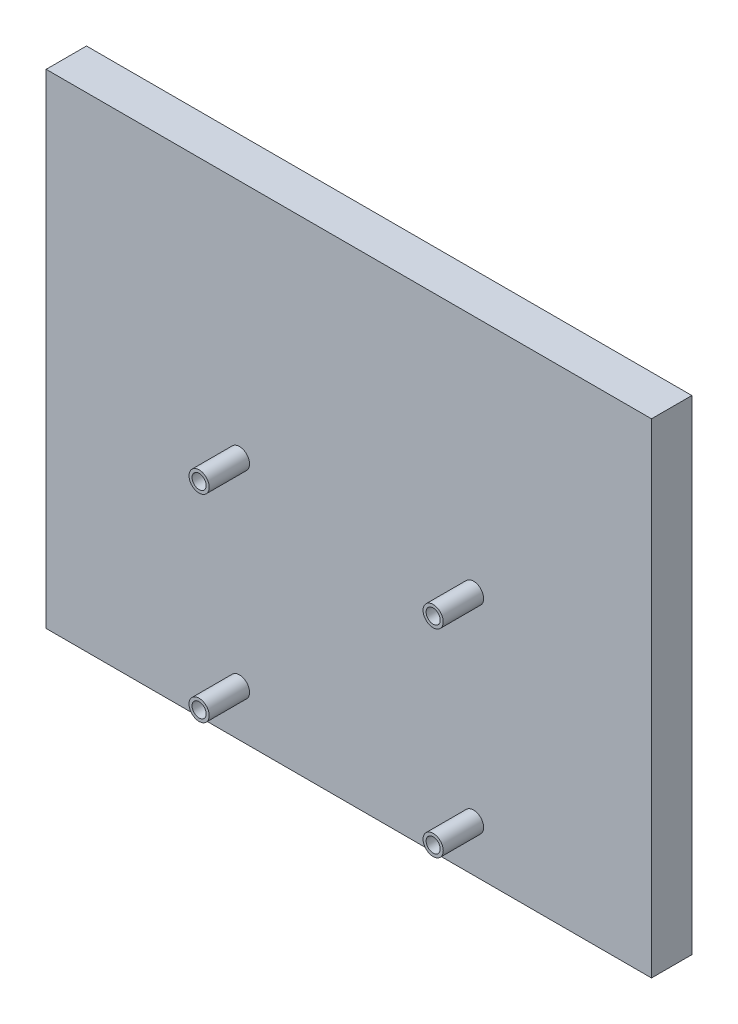
ISO-10303-21;
HEADER;
FILE_DESCRIPTION(('STEP AP214'),'2;1');
FILE_NAME('part.step','',(''),(''),'','','');
FILE_SCHEMA(('AUTOMOTIVE_DESIGN { 1 0 10303 214 1 1 1 1 }'));
ENDSEC;
DATA;
#1=APPLICATION_CONTEXT('core data for automotive mechanical design processes');
#2=APPLICATION_PROTOCOL_DEFINITION('international standard','automotive_design',2000,#1);
#3=PRODUCT_CONTEXT('',#1,'mechanical');
#4=PRODUCT('Part','Part','',(#3));
#5=PRODUCT_RELATED_PRODUCT_CATEGORY('part','',(#4));
#6=PRODUCT_DEFINITION_FORMATION('','',#4);
#7=PRODUCT_DEFINITION_CONTEXT('part definition',#1,'design');
#8=PRODUCT_DEFINITION('design','',#6,#7);
#9=PRODUCT_DEFINITION_SHAPE('','',#8);
#10=(LENGTH_UNIT() NAMED_UNIT(*) SI_UNIT(.MILLI.,.METRE.));
#11=(NAMED_UNIT(*) PLANE_ANGLE_UNIT() SI_UNIT($,.RADIAN.));
#12=(NAMED_UNIT(*) SI_UNIT($,.STERADIAN.) SOLID_ANGLE_UNIT());
#13=UNCERTAINTY_MEASURE_WITH_UNIT(LENGTH_MEASURE(1.E-05),#10,'distance_accuracy_value','');
#14=(GEOMETRIC_REPRESENTATION_CONTEXT(3) GLOBAL_UNCERTAINTY_ASSIGNED_CONTEXT((#13)) GLOBAL_UNIT_ASSIGNED_CONTEXT((#10,
#11,#12)) REPRESENTATION_CONTEXT('',''));
#15=CARTESIAN_POINT('',(0.,0.,0.));
#16=DIRECTION('',(0.,0.,1.));
#17=DIRECTION('',(1.,0.,0.));
#18=AXIS2_PLACEMENT_3D('',#15,#16,#17);
#19=CARTESIAN_POINT('',(150.,60.,10.));
#20=DIRECTION('',(-1.,0.,0.));
#21=DIRECTION('',(0.,0.,1.));
#22=AXIS2_PLACEMENT_3D('',#19,#20,#21);
#23=PLANE('',#22);
#24=DIRECTION('',(0.,1.,0.));
#25=VECTOR('',#24,1.);
#26=CARTESIAN_POINT('',(150.,60.,0.));
#27=LINE('',#26,#25);
#28=CARTESIAN_POINT('',(150.,-60.,0.));
#29=VERTEX_POINT('',#28);
#30=CARTESIAN_POINT('',(150.,60.,0.));
#31=VERTEX_POINT('',#30);
#32=EDGE_CURVE('E98',#29,#31,#27,.T.);
#33=ORIENTED_EDGE('',*,*,#32,.T.);
#34=DIRECTION('',(0.,0.,-1.));
#35=VECTOR('',#34,1.);
#36=CARTESIAN_POINT('',(150.,60.,10.));
#37=LINE('',#36,#35);
#38=CARTESIAN_POINT('',(150.,60.,10.));
#39=VERTEX_POINT('',#38);
#40=EDGE_CURVE('E11',#39,#31,#37,.T.);
#41=ORIENTED_EDGE('',*,*,#40,.F.);
#42=DIRECTION('',(0.,1.,0.));
#43=VECTOR('',#42,1.);
#44=CARTESIAN_POINT('',(150.,60.,10.));
#45=LINE('',#44,#43);
#46=CARTESIAN_POINT('',(150.,-60.,10.));
#47=VERTEX_POINT('',#46);
#48=EDGE_CURVE('E86',#47,#39,#45,.T.);
#49=ORIENTED_EDGE('',*,*,#48,.F.);
#50=DIRECTION('',(0.,0.,-1.));
#51=VECTOR('',#50,1.);
#52=CARTESIAN_POINT('',(150.,-60.,10.));
#53=LINE('',#52,#51);
#54=EDGE_CURVE('E94',#47,#29,#53,.T.);
#55=ORIENTED_EDGE('',*,*,#54,.T.);
#56=EDGE_LOOP('',(#33,#41,#49,#55));
#57=FACE_BOUND('',#56,.T.);
#58=ADVANCED_FACE('F35',(#57),#23,.F.);
#59=CARTESIAN_POINT('',(0.,60.,10.));
#60=DIRECTION('',(0.,-1.,0.));
#61=DIRECTION('',(1.,0.,0.));
#62=AXIS2_PLACEMENT_3D('',#59,#60,#61);
#63=PLANE('',#62);
#64=DIRECTION('',(-1.,0.,0.));
#65=VECTOR('',#64,1.);
#66=CARTESIAN_POINT('',(0.,60.,0.));
#67=LINE('',#66,#65);
#68=CARTESIAN_POINT('',(0.,60.,0.));
#69=VERTEX_POINT('',#68);
#70=EDGE_CURVE('E90',#31,#69,#67,.T.);
#71=ORIENTED_EDGE('',*,*,#70,.T.);
#72=DIRECTION('',(0.,0.,-1.));
#73=VECTOR('',#72,1.);
#74=CARTESIAN_POINT('',(0.,60.,10.));
#75=LINE('',#74,#73);
#76=CARTESIAN_POINT('',(0.,60.,10.));
#77=VERTEX_POINT('',#76);
#78=EDGE_CURVE('E43',#77,#69,#75,.T.);
#79=ORIENTED_EDGE('',*,*,#78,.F.);
#80=DIRECTION('',(-1.,0.,0.));
#81=VECTOR('',#80,1.);
#82=CARTESIAN_POINT('',(0.,60.,10.));
#83=LINE('',#82,#81);
#84=EDGE_CURVE('E81',#39,#77,#83,.T.);
#85=ORIENTED_EDGE('',*,*,#84,.F.);
#86=ORIENTED_EDGE('',*,*,#40,.T.);
#87=EDGE_LOOP('',(#71,#79,#85,#86));
#88=FACE_BOUND('',#87,.T.);
#89=ADVANCED_FACE('F89',(#88),#63,.F.);
#90=CARTESIAN_POINT('',(0.,60.,10.));
#91=DIRECTION('',(1.,0.,0.));
#92=DIRECTION('',(0.,0.,-1.));
#93=AXIS2_PLACEMENT_3D('',#90,#91,#92);
#94=PLANE('',#93);
#95=CARTESIAN_POINT('',(0.,-30.,5.));
#96=DIRECTION('',(-1.,0.,0.));
#97=DIRECTION('',(0.,0.,1.));
#98=AXIS2_PLACEMENT_3D('',#95,#96,#97);
#99=CIRCLE('',#98,4.);
#100=CARTESIAN_POINT('',(0.,-30.,9.));
#101=VERTEX_POINT('',#100);
#102=EDGE_CURVE('E118',#101,#101,#99,.T.);
#103=ORIENTED_EDGE('',*,*,#102,.F.);
#104=EDGE_LOOP('',(#103));
#105=FACE_BOUND('',#104,.T.);
#106=CARTESIAN_POINT('',(0.,30.,5.00000000000001));
#107=DIRECTION('',(-1.,0.,0.));
#108=DIRECTION('',(0.,0.,1.));
#109=AXIS2_PLACEMENT_3D('',#106,#107,#108);
#110=CIRCLE('',#109,4.);
#111=CARTESIAN_POINT('',(0.,30.,9.00000000000001));
#112=VERTEX_POINT('',#111);
#113=EDGE_CURVE('E125',#112,#112,#110,.T.);
#114=ORIENTED_EDGE('',*,*,#113,.F.);
#115=EDGE_LOOP('',(#114));
#116=FACE_BOUND('',#115,.T.);
#117=CARTESIAN_POINT('',(0.,0.,5.00000000000001));
#118=DIRECTION('',(-1.,0.,0.));
#119=DIRECTION('',(0.,0.,1.));
#120=AXIS2_PLACEMENT_3D('',#117,#118,#119);
#121=CIRCLE('',#120,4.);
#122=CARTESIAN_POINT('',(0.,0.,9.00000000000001));
#123=VERTEX_POINT('',#122);
#124=EDGE_CURVE('E112',#123,#123,#121,.T.);
#125=ORIENTED_EDGE('',*,*,#124,.F.);
#126=EDGE_LOOP('',(#125));
#127=FACE_BOUND('',#126,.T.);
#128=DIRECTION('',(0.,-1.,0.));
#129=VECTOR('',#128,1.);
#130=CARTESIAN_POINT('',(0.,60.,0.));
#131=LINE('',#130,#129);
#132=CARTESIAN_POINT('',(0.,-60.,0.));
#133=VERTEX_POINT('',#132);
#134=EDGE_CURVE('E68',#69,#133,#131,.T.);
#135=ORIENTED_EDGE('',*,*,#134,.T.);
#136=DIRECTION('',(0.,0.,-1.));
#137=VECTOR('',#136,1.);
#138=CARTESIAN_POINT('',(0.,-60.,10.));
#139=LINE('',#138,#137);
#140=CARTESIAN_POINT('',(0.,-60.,10.));
#141=VERTEX_POINT('',#140);
#142=EDGE_CURVE('E91',#141,#133,#139,.T.);
#143=ORIENTED_EDGE('',*,*,#142,.F.);
#144=DIRECTION('',(0.,-1.,0.));
#145=VECTOR('',#144,1.);
#146=CARTESIAN_POINT('',(0.,60.,10.));
#147=LINE('',#146,#145);
#148=EDGE_CURVE('E84',#77,#141,#147,.T.);
#149=ORIENTED_EDGE('',*,*,#148,.F.);
#150=ORIENTED_EDGE('',*,*,#78,.T.);
#151=EDGE_LOOP('',(#135,#143,#149,#150));
#152=FACE_BOUND('',#151,.T.);
#153=ADVANCED_FACE('F92',(#105,#116,#127,#152),#94,.F.);
#154=CARTESIAN_POINT('',(0.,-60.,10.));
#155=DIRECTION('',(0.,1.,0.));
#156=DIRECTION('',(-1.,0.,0.));
#157=AXIS2_PLACEMENT_3D('',#154,#155,#156);
#158=PLANE('',#157);
#159=DIRECTION('',(1.,0.,0.));
#160=VECTOR('',#159,1.);
#161=CARTESIAN_POINT('',(0.,-60.,0.));
#162=LINE('',#161,#160);
#163=EDGE_CURVE('E74',#133,#29,#162,.T.);
#164=ORIENTED_EDGE('',*,*,#163,.T.);
#165=ORIENTED_EDGE('',*,*,#54,.F.);
#166=DIRECTION('',(1.,0.,0.));
#167=VECTOR('',#166,1.);
#168=CARTESIAN_POINT('',(0.,-60.,10.));
#169=LINE('',#168,#167);
#170=EDGE_CURVE('E51',#141,#47,#169,.T.);
#171=ORIENTED_EDGE('',*,*,#170,.F.);
#172=ORIENTED_EDGE('',*,*,#142,.T.);
#173=EDGE_LOOP('',(#164,#165,#171,#172));
#174=FACE_BOUND('',#173,.T.);
#175=ADVANCED_FACE('F106',(#174),#158,.F.);
#176=CARTESIAN_POINT('',(0.,0.,10.));
#177=DIRECTION('',(0.,0.,1.));
#178=DIRECTION('',(1.,0.,0.));
#179=AXIS2_PLACEMENT_3D('',#176,#177,#178);
#180=PLANE('',#179);
#181=CARTESIAN_POINT('',(47.9001152163457,-48.5,10.));
#182=DIRECTION('',(0.,0.,1.));
#183=DIRECTION('',(1.,0.,0.));
#184=AXIS2_PLACEMENT_3D('',#181,#182,#183);
#185=CIRCLE('',#184,2.50000000000001);
#186=CARTESIAN_POINT('',(50.4001152163457,-48.5,10.));
#187=VERTEX_POINT('',#186);
#188=EDGE_CURVE('E148',#187,#187,#185,.T.);
#189=ORIENTED_EDGE('',*,*,#188,.F.);
#190=EDGE_LOOP('',(#189));
#191=FACE_BOUND('',#190,.T.);
#192=CARTESIAN_POINT('',(105.9,-48.5,10.));
#193=DIRECTION('',(0.,0.,1.));
#194=DIRECTION('',(1.,0.,0.));
#195=AXIS2_PLACEMENT_3D('',#192,#193,#194);
#196=CIRCLE('',#195,2.5);
#197=CARTESIAN_POINT('',(108.4,-48.5,10.));
#198=VERTEX_POINT('',#197);
#199=EDGE_CURVE('E142',#198,#198,#196,.T.);
#200=ORIENTED_EDGE('',*,*,#199,.F.);
#201=EDGE_LOOP('',(#200));
#202=FACE_BOUND('',#201,.T.);
#203=CARTESIAN_POINT('',(105.9,0.615607451466016,10.));
#204=DIRECTION('',(0.,0.,1.));
#205=DIRECTION('',(1.,0.,0.));
#206=AXIS2_PLACEMENT_3D('',#203,#204,#205);
#207=CIRCLE('',#206,2.5);
#208=CARTESIAN_POINT('',(108.4,0.615607451466016,10.));
#209=VERTEX_POINT('',#208);
#210=EDGE_CURVE('E136',#209,#209,#207,.T.);
#211=ORIENTED_EDGE('',*,*,#210,.F.);
#212=EDGE_LOOP('',(#211));
#213=FACE_BOUND('',#212,.T.);
#214=CARTESIAN_POINT('',(47.9001152163457,0.499999999999987,10.));
#215=DIRECTION('',(0.,0.,1.));
#216=DIRECTION('',(1.,0.,0.));
#217=AXIS2_PLACEMENT_3D('',#214,#215,#216);
#218=CIRCLE('',#217,2.50000000000001);
#219=CARTESIAN_POINT('',(50.4001152163457,0.499999999999987,10.));
#220=VERTEX_POINT('',#219);
#221=EDGE_CURVE('E130',#220,#220,#218,.T.);
#222=ORIENTED_EDGE('',*,*,#221,.F.);
#223=EDGE_LOOP('',(#222));
#224=FACE_BOUND('',#223,.T.);
#225=ORIENTED_EDGE('',*,*,#48,.T.);
#226=ORIENTED_EDGE('',*,*,#84,.T.);
#227=ORIENTED_EDGE('',*,*,#148,.T.);
#228=ORIENTED_EDGE('',*,*,#170,.T.);
#229=EDGE_LOOP('',(#225,#226,#227,#228));
#230=FACE_BOUND('',#229,.T.);
#231=ADVANCED_FACE('F82',(#191,#202,#213,#224,#230),#180,.T.);
#232=CARTESIAN_POINT('',(0.,0.,0.));
#233=DIRECTION('',(0.,0.,1.));
#234=DIRECTION('',(1.,0.,0.));
#235=AXIS2_PLACEMENT_3D('',#232,#233,#234);
#236=PLANE('',#235);
#237=ORIENTED_EDGE('',*,*,#32,.F.);
#238=ORIENTED_EDGE('',*,*,#163,.F.);
#239=ORIENTED_EDGE('',*,*,#134,.F.);
#240=ORIENTED_EDGE('',*,*,#70,.F.);
#241=EDGE_LOOP('',(#237,#238,#239,#240));
#242=FACE_BOUND('',#241,.T.);
#243=ADVANCED_FACE('F109',(#242),#236,.F.);
#244=CARTESIAN_POINT('',(30.,0.,5.00000000000001));
#245=DIRECTION('',(-1.,0.,0.));
#246=DIRECTION('',(0.,0.,1.));
#247=AXIS2_PLACEMENT_3D('',#244,#245,#246);
#248=CYLINDRICAL_SURFACE('',#247,4.);
#249=CARTESIAN_POINT('',(30.,0.,5.00000000000001));
#250=DIRECTION('',(-1.,0.,0.));
#251=DIRECTION('',(0.,0.,1.));
#252=AXIS2_PLACEMENT_3D('',#249,#250,#251);
#253=CIRCLE('',#252,4.);
#254=CARTESIAN_POINT('',(30.,0.,9.00000000000001));
#255=VERTEX_POINT('',#254);
#256=EDGE_CURVE('E101',#255,#255,#253,.T.);
#257=ORIENTED_EDGE('',*,*,#256,.F.);
#258=EDGE_LOOP('',(#257));
#259=FACE_BOUND('',#258,.T.);
#260=ORIENTED_EDGE('',*,*,#124,.T.);
#261=EDGE_LOOP('',(#260));
#262=FACE_BOUND('',#261,.T.);
#263=ADVANCED_FACE('F239',(#259,#262),#248,.F.);
#264=CARTESIAN_POINT('',(30.,0.,5.00000000000001));
#265=DIRECTION('',(-1.,0.,0.));
#266=DIRECTION('',(0.,0.,1.));
#267=AXIS2_PLACEMENT_3D('',#264,#265,#266);
#268=PLANE('',#267);
#269=ORIENTED_EDGE('',*,*,#256,.T.);
#270=EDGE_LOOP('',(#269));
#271=FACE_BOUND('',#270,.T.);
#272=ADVANCED_FACE('F243',(#271),#268,.T.);
#273=CARTESIAN_POINT('',(30.,30.,5.00000000000001));
#274=DIRECTION('',(-1.,0.,0.));
#275=DIRECTION('',(0.,0.,1.));
#276=AXIS2_PLACEMENT_3D('',#273,#274,#275);
#277=CYLINDRICAL_SURFACE('',#276,4.);
#278=CARTESIAN_POINT('',(30.,30.,5.00000000000001));
#279=DIRECTION('',(-1.,0.,0.));
#280=DIRECTION('',(0.,0.,1.));
#281=AXIS2_PLACEMENT_3D('',#278,#279,#280);
#282=CIRCLE('',#281,4.);
#283=CARTESIAN_POINT('',(30.,30.,9.00000000000001));
#284=VERTEX_POINT('',#283);
#285=EDGE_CURVE('E115',#284,#284,#282,.T.);
#286=ORIENTED_EDGE('',*,*,#285,.F.);
#287=EDGE_LOOP('',(#286));
#288=FACE_BOUND('',#287,.T.);
#289=ORIENTED_EDGE('',*,*,#113,.T.);
#290=EDGE_LOOP('',(#289));
#291=FACE_BOUND('',#290,.T.);
#292=ADVANCED_FACE('F247',(#288,#291),#277,.F.);
#293=CARTESIAN_POINT('',(30.,30.,5.00000000000001));
#294=DIRECTION('',(-1.,0.,0.));
#295=DIRECTION('',(0.,0.,1.));
#296=AXIS2_PLACEMENT_3D('',#293,#294,#295);
#297=PLANE('',#296);
#298=ORIENTED_EDGE('',*,*,#285,.T.);
#299=EDGE_LOOP('',(#298));
#300=FACE_BOUND('',#299,.T.);
#301=ADVANCED_FACE('F250',(#300),#297,.T.);
#302=CARTESIAN_POINT('',(30.,-30.,5.));
#303=DIRECTION('',(-1.,0.,0.));
#304=DIRECTION('',(0.,0.,1.));
#305=AXIS2_PLACEMENT_3D('',#302,#303,#304);
#306=CYLINDRICAL_SURFACE('',#305,4.);
#307=CARTESIAN_POINT('',(30.,-30.,5.));
#308=DIRECTION('',(-1.,0.,0.));
#309=DIRECTION('',(0.,0.,1.));
#310=AXIS2_PLACEMENT_3D('',#307,#308,#309);
#311=CIRCLE('',#310,4.);
#312=CARTESIAN_POINT('',(30.,-30.,9.));
#313=VERTEX_POINT('',#312);
#314=EDGE_CURVE('E121',#313,#313,#311,.T.);
#315=ORIENTED_EDGE('',*,*,#314,.F.);
#316=EDGE_LOOP('',(#315));
#317=FACE_BOUND('',#316,.T.);
#318=ORIENTED_EDGE('',*,*,#102,.T.);
#319=EDGE_LOOP('',(#318));
#320=FACE_BOUND('',#319,.T.);
#321=ADVANCED_FACE('F221',(#317,#320),#306,.F.);
#322=CARTESIAN_POINT('',(30.,-30.,5.));
#323=DIRECTION('',(-1.,0.,0.));
#324=DIRECTION('',(0.,0.,1.));
#325=AXIS2_PLACEMENT_3D('',#322,#323,#324);
#326=PLANE('',#325);
#327=ORIENTED_EDGE('',*,*,#314,.T.);
#328=EDGE_LOOP('',(#327));
#329=FACE_BOUND('',#328,.T.);
#330=ADVANCED_FACE('F211',(#329),#326,.T.);
#331=CARTESIAN_POINT('',(47.9001152163457,0.499999999999987,20.));
#332=DIRECTION('',(0.,0.,-1.));
#333=DIRECTION('',(-1.,0.,0.));
#334=AXIS2_PLACEMENT_3D('',#331,#332,#333);
#335=CYLINDRICAL_SURFACE('',#334,2.50000000000001);
#336=CARTESIAN_POINT('',(47.9001152163457,0.499999999999987,20.));
#337=DIRECTION('',(0.,0.,1.));
#338=DIRECTION('',(1.,0.,0.));
#339=AXIS2_PLACEMENT_3D('',#336,#337,#338);
#340=CIRCLE('',#339,2.50000000000001);
#341=CARTESIAN_POINT('',(50.4001152163457,0.499999999999987,20.));
#342=VERTEX_POINT('',#341);
#343=EDGE_CURVE('E122',#342,#342,#340,.T.);
#344=ORIENTED_EDGE('',*,*,#343,.F.);
#345=EDGE_LOOP('',(#344));
#346=FACE_BOUND('',#345,.T.);
#347=ORIENTED_EDGE('',*,*,#221,.T.);
#348=EDGE_LOOP('',(#347));
#349=FACE_BOUND('',#348,.T.);
#350=ADVANCED_FACE('F208',(#346,#349),#335,.T.);
#351=CARTESIAN_POINT('',(47.9001152163457,0.499999999999987,20.));
#352=DIRECTION('',(0.,0.,1.));
#353=DIRECTION('',(1.,0.,0.));
#354=AXIS2_PLACEMENT_3D('',#351,#352,#353);
#355=PLANE('',#354);
#356=CARTESIAN_POINT('',(47.9001152163457,0.499999999999987,20.));
#357=DIRECTION('',(0.,0.,1.));
#358=DIRECTION('',(1.,0.,0.));
#359=AXIS2_PLACEMENT_3D('',#356,#357,#358);
#360=CIRCLE('',#359,1.75);
#361=CARTESIAN_POINT('',(49.6501152163457,0.499999999999987,20.));
#362=VERTEX_POINT('',#361);
#363=EDGE_CURVE('E154',#362,#362,#360,.T.);
#364=ORIENTED_EDGE('',*,*,#363,.F.);
#365=EDGE_LOOP('',(#364));
#366=FACE_BOUND('',#365,.T.);
#367=ORIENTED_EDGE('',*,*,#343,.T.);
#368=EDGE_LOOP('',(#367));
#369=FACE_BOUND('',#368,.T.);
#370=ADVANCED_FACE('F210',(#366,#369),#355,.T.);
#371=CARTESIAN_POINT('',(105.9,0.615607451466016,20.));
#372=DIRECTION('',(0.,0.,-1.));
#373=DIRECTION('',(-1.,0.,0.));
#374=AXIS2_PLACEMENT_3D('',#371,#372,#373);
#375=CYLINDRICAL_SURFACE('',#374,2.5);
#376=CARTESIAN_POINT('',(105.9,0.615607451466016,20.));
#377=DIRECTION('',(0.,0.,1.));
#378=DIRECTION('',(1.,0.,0.));
#379=AXIS2_PLACEMENT_3D('',#376,#377,#378);
#380=CIRCLE('',#379,2.5);
#381=CARTESIAN_POINT('',(108.4,0.615607451466016,20.));
#382=VERTEX_POINT('',#381);
#383=EDGE_CURVE('E133',#382,#382,#380,.T.);
#384=ORIENTED_EDGE('',*,*,#383,.F.);
#385=EDGE_LOOP('',(#384));
#386=FACE_BOUND('',#385,.T.);
#387=ORIENTED_EDGE('',*,*,#210,.T.);
#388=EDGE_LOOP('',(#387));
#389=FACE_BOUND('',#388,.T.);
#390=ADVANCED_FACE('F218',(#386,#389),#375,.T.);
#391=CARTESIAN_POINT('',(105.9,0.615607451466016,20.));
#392=DIRECTION('',(0.,0.,1.));
#393=DIRECTION('',(1.,0.,0.));
#394=AXIS2_PLACEMENT_3D('',#391,#392,#393);
#395=PLANE('',#394);
#396=CARTESIAN_POINT('',(105.9,0.615607451466016,20.));
#397=DIRECTION('',(0.,0.,1.));
#398=DIRECTION('',(1.,0.,0.));
#399=AXIS2_PLACEMENT_3D('',#396,#397,#398);
#400=CIRCLE('',#399,1.75);
#401=CARTESIAN_POINT('',(107.65,0.615607451466016,20.));
#402=VERTEX_POINT('',#401);
#403=EDGE_CURVE('E160',#402,#402,#400,.T.);
#404=ORIENTED_EDGE('',*,*,#403,.F.);
#405=EDGE_LOOP('',(#404));
#406=FACE_BOUND('',#405,.T.);
#407=ORIENTED_EDGE('',*,*,#383,.T.);
#408=EDGE_LOOP('',(#407));
#409=FACE_BOUND('',#408,.T.);
#410=ADVANCED_FACE('F298',(#406,#409),#395,.T.);
#411=CARTESIAN_POINT('',(105.9,-48.5,20.));
#412=DIRECTION('',(0.,0.,-1.));
#413=DIRECTION('',(-1.,0.,0.));
#414=AXIS2_PLACEMENT_3D('',#411,#412,#413);
#415=CYLINDRICAL_SURFACE('',#414,2.5);
#416=CARTESIAN_POINT('',(105.9,-48.5,20.));
#417=DIRECTION('',(0.,0.,1.));
#418=DIRECTION('',(1.,0.,0.));
#419=AXIS2_PLACEMENT_3D('',#416,#417,#418);
#420=CIRCLE('',#419,2.5);
#421=CARTESIAN_POINT('',(108.4,-48.5,20.));
#422=VERTEX_POINT('',#421);
#423=EDGE_CURVE('E139',#422,#422,#420,.T.);
#424=ORIENTED_EDGE('',*,*,#423,.F.);
#425=EDGE_LOOP('',(#424));
#426=FACE_BOUND('',#425,.T.);
#427=ORIENTED_EDGE('',*,*,#199,.T.);
#428=EDGE_LOOP('',(#427));
#429=FACE_BOUND('',#428,.T.);
#430=ADVANCED_FACE('F306',(#426,#429),#415,.T.);
#431=CARTESIAN_POINT('',(105.9,-48.5,20.));
#432=DIRECTION('',(0.,0.,1.));
#433=DIRECTION('',(1.,0.,0.));
#434=AXIS2_PLACEMENT_3D('',#431,#432,#433);
#435=PLANE('',#434);
#436=CARTESIAN_POINT('',(105.9,-48.5,20.));
#437=DIRECTION('',(0.,0.,1.));
#438=DIRECTION('',(1.,0.,0.));
#439=AXIS2_PLACEMENT_3D('',#436,#437,#438);
#440=CIRCLE('',#439,1.75);
#441=CARTESIAN_POINT('',(107.65,-48.5,20.));
#442=VERTEX_POINT('',#441);
#443=EDGE_CURVE('E166',#442,#442,#440,.T.);
#444=ORIENTED_EDGE('',*,*,#443,.F.);
#445=EDGE_LOOP('',(#444));
#446=FACE_BOUND('',#445,.T.);
#447=ORIENTED_EDGE('',*,*,#423,.T.);
#448=EDGE_LOOP('',(#447));
#449=FACE_BOUND('',#448,.T.);
#450=ADVANCED_FACE('F195',(#446,#449),#435,.T.);
#451=CARTESIAN_POINT('',(47.9001152163457,-48.5,20.));
#452=DIRECTION('',(0.,0.,-1.));
#453=DIRECTION('',(-1.,0.,0.));
#454=AXIS2_PLACEMENT_3D('',#451,#452,#453);
#455=CYLINDRICAL_SURFACE('',#454,2.50000000000001);
#456=CARTESIAN_POINT('',(47.9001152163457,-48.5,20.));
#457=DIRECTION('',(0.,0.,1.));
#458=DIRECTION('',(1.,0.,0.));
#459=AXIS2_PLACEMENT_3D('',#456,#457,#458);
#460=CIRCLE('',#459,2.50000000000001);
#461=CARTESIAN_POINT('',(50.4001152163457,-48.5,20.));
#462=VERTEX_POINT('',#461);
#463=EDGE_CURVE('E145',#462,#462,#460,.T.);
#464=ORIENTED_EDGE('',*,*,#463,.F.);
#465=EDGE_LOOP('',(#464));
#466=FACE_BOUND('',#465,.T.);
#467=ORIENTED_EDGE('',*,*,#188,.T.);
#468=EDGE_LOOP('',(#467));
#469=FACE_BOUND('',#468,.T.);
#470=ADVANCED_FACE('F189',(#466,#469),#455,.T.);
#471=CARTESIAN_POINT('',(47.9001152163457,-48.5,20.));
#472=DIRECTION('',(0.,0.,1.));
#473=DIRECTION('',(1.,0.,0.));
#474=AXIS2_PLACEMENT_3D('',#471,#472,#473);
#475=PLANE('',#474);
#476=CARTESIAN_POINT('',(47.9001152163457,-48.5,20.));
#477=DIRECTION('',(0.,0.,1.));
#478=DIRECTION('',(1.,0.,0.));
#479=AXIS2_PLACEMENT_3D('',#476,#477,#478);
#480=CIRCLE('',#479,1.75);
#481=CARTESIAN_POINT('',(49.6501152163457,-48.5,20.));
#482=VERTEX_POINT('',#481);
#483=EDGE_CURVE('E172',#482,#482,#480,.T.);
#484=ORIENTED_EDGE('',*,*,#483,.F.);
#485=EDGE_LOOP('',(#484));
#486=FACE_BOUND('',#485,.T.);
#487=ORIENTED_EDGE('',*,*,#463,.T.);
#488=EDGE_LOOP('',(#487));
#489=FACE_BOUND('',#488,.T.);
#490=ADVANCED_FACE('F183',(#486,#489),#475,.T.);
#491=CARTESIAN_POINT('',(47.9001152163457,-48.5,11.));
#492=DIRECTION('',(0.,0.,1.));
#493=DIRECTION('',(1.,0.,0.));
#494=AXIS2_PLACEMENT_3D('',#491,#492,#493);
#495=CYLINDRICAL_SURFACE('',#494,1.75);
#496=CARTESIAN_POINT('',(47.9001152163457,-48.5,11.));
#497=DIRECTION('',(0.,0.,1.));
#498=DIRECTION('',(1.,0.,0.));
#499=AXIS2_PLACEMENT_3D('',#496,#497,#498);
#500=CIRCLE('',#499,1.75);
#501=CARTESIAN_POINT('',(49.6501152163457,-48.5,11.));
#502=VERTEX_POINT('',#501);
#503=EDGE_CURVE('E157',#502,#502,#500,.T.);
#504=ORIENTED_EDGE('',*,*,#503,.F.);
#505=EDGE_LOOP('',(#504));
#506=FACE_BOUND('',#505,.T.);
#507=ORIENTED_EDGE('',*,*,#483,.T.);
#508=EDGE_LOOP('',(#507));
#509=FACE_BOUND('',#508,.T.);
#510=ADVANCED_FACE('F180',(#506,#509),#495,.F.);
#511=CARTESIAN_POINT('',(47.9001152163457,-48.5,11.));
#512=DIRECTION('',(0.,0.,1.));
#513=DIRECTION('',(1.,0.,0.));
#514=AXIS2_PLACEMENT_3D('',#511,#512,#513);
#515=PLANE('',#514);
#516=ORIENTED_EDGE('',*,*,#503,.T.);
#517=EDGE_LOOP('',(#516));
#518=FACE_BOUND('',#517,.T.);
#519=ADVANCED_FACE('F178',(#518),#515,.T.);
#520=CARTESIAN_POINT('',(105.9,-48.5,11.));
#521=DIRECTION('',(0.,0.,1.));
#522=DIRECTION('',(1.,0.,0.));
#523=AXIS2_PLACEMENT_3D('',#520,#521,#522);
#524=CYLINDRICAL_SURFACE('',#523,1.75);
#525=CARTESIAN_POINT('',(105.9,-48.5,11.));
#526=DIRECTION('',(0.,0.,1.));
#527=DIRECTION('',(1.,0.,0.));
#528=AXIS2_PLACEMENT_3D('',#525,#526,#527);
#529=CIRCLE('',#528,1.75);
#530=CARTESIAN_POINT('',(107.65,-48.5,11.));
#531=VERTEX_POINT('',#530);
#532=EDGE_CURVE('E169',#531,#531,#529,.T.);
#533=ORIENTED_EDGE('',*,*,#532,.F.);
#534=EDGE_LOOP('',(#533));
#535=FACE_BOUND('',#534,.T.);
#536=ORIENTED_EDGE('',*,*,#443,.T.);
#537=EDGE_LOOP('',(#536));
#538=FACE_BOUND('',#537,.T.);
#539=ADVANCED_FACE('F359',(#535,#538),#524,.F.);
#540=CARTESIAN_POINT('',(105.9,-48.5,11.));
#541=DIRECTION('',(0.,0.,1.));
#542=DIRECTION('',(1.,0.,0.));
#543=AXIS2_PLACEMENT_3D('',#540,#541,#542);
#544=PLANE('',#543);
#545=ORIENTED_EDGE('',*,*,#532,.T.);
#546=EDGE_LOOP('',(#545));
#547=FACE_BOUND('',#546,.T.);
#548=ADVANCED_FACE('F368',(#547),#544,.T.);
#549=CARTESIAN_POINT('',(105.9,0.615607451466016,11.));
#550=DIRECTION('',(0.,0.,1.));
#551=DIRECTION('',(1.,0.,0.));
#552=AXIS2_PLACEMENT_3D('',#549,#550,#551);
#553=CYLINDRICAL_SURFACE('',#552,1.75);
#554=CARTESIAN_POINT('',(105.9,0.615607451466016,11.));
#555=DIRECTION('',(0.,0.,1.));
#556=DIRECTION('',(1.,0.,0.));
#557=AXIS2_PLACEMENT_3D('',#554,#555,#556);
#558=CIRCLE('',#557,1.75);
#559=CARTESIAN_POINT('',(107.65,0.615607451466016,11.));
#560=VERTEX_POINT('',#559);
#561=EDGE_CURVE('E163',#560,#560,#558,.T.);
#562=ORIENTED_EDGE('',*,*,#561,.F.);
#563=EDGE_LOOP('',(#562));
#564=FACE_BOUND('',#563,.T.);
#565=ORIENTED_EDGE('',*,*,#403,.T.);
#566=EDGE_LOOP('',(#565));
#567=FACE_BOUND('',#566,.T.);
#568=ADVANCED_FACE('F378',(#564,#567),#553,.F.);
#569=CARTESIAN_POINT('',(105.9,0.615607451466016,11.));
#570=DIRECTION('',(0.,0.,1.));
#571=DIRECTION('',(1.,0.,0.));
#572=AXIS2_PLACEMENT_3D('',#569,#570,#571);
#573=PLANE('',#572);
#574=ORIENTED_EDGE('',*,*,#561,.T.);
#575=EDGE_LOOP('',(#574));
#576=FACE_BOUND('',#575,.T.);
#577=ADVANCED_FACE('F388',(#576),#573,.T.);
#578=CARTESIAN_POINT('',(47.9001152163457,0.499999999999987,11.));
#579=DIRECTION('',(0.,0.,1.));
#580=DIRECTION('',(1.,0.,0.));
#581=AXIS2_PLACEMENT_3D('',#578,#579,#580);
#582=CYLINDRICAL_SURFACE('',#581,1.75);
#583=CARTESIAN_POINT('',(47.9001152163457,0.499999999999987,11.));
#584=DIRECTION('',(0.,0.,1.));
#585=DIRECTION('',(1.,0.,0.));
#586=AXIS2_PLACEMENT_3D('',#583,#584,#585);
#587=CIRCLE('',#586,1.75);
#588=CARTESIAN_POINT('',(49.6501152163457,0.499999999999987,11.));
#589=VERTEX_POINT('',#588);
#590=EDGE_CURVE('E151',#589,#589,#587,.T.);
#591=ORIENTED_EDGE('',*,*,#590,.F.);
#592=EDGE_LOOP('',(#591));
#593=FACE_BOUND('',#592,.T.);
#594=ORIENTED_EDGE('',*,*,#363,.T.);
#595=EDGE_LOOP('',(#594));
#596=FACE_BOUND('',#595,.T.);
#597=ADVANCED_FACE('F398',(#593,#596),#582,.F.);
#598=CARTESIAN_POINT('',(47.9001152163457,0.499999999999987,11.));
#599=DIRECTION('',(0.,0.,1.));
#600=DIRECTION('',(1.,0.,0.));
#601=AXIS2_PLACEMENT_3D('',#598,#599,#600);
#602=PLANE('',#601);
#603=ORIENTED_EDGE('',*,*,#590,.T.);
#604=EDGE_LOOP('',(#603));
#605=FACE_BOUND('',#604,.T.);
#606=ADVANCED_FACE('F408',(#605),#602,.T.);
#607=CLOSED_SHELL('',(#58,#89,#153,#175,#231,#243,#263,#272,#292,#301,#321,#330,#350,#370,#390,
#410,#430,#450,#470,#490,#510,#519,#539,#548,#568,#577,#597,#606));
#608=MANIFOLD_SOLID_BREP('B2',#607);
#609=ADVANCED_BREP_SHAPE_REPRESENTATION('',(#18,#608),#14);
#610=SHAPE_DEFINITION_REPRESENTATION(#9,#609);
ENDSEC;
END-ISO-10303-21;
